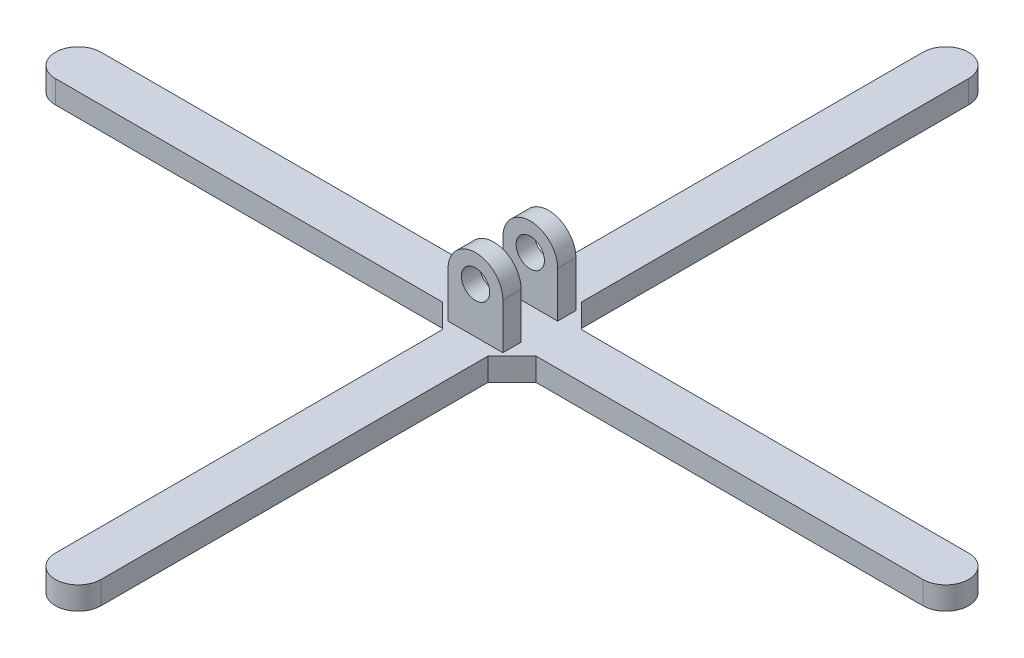
ISO-10303-21;
HEADER;
FILE_DESCRIPTION(('STEP AP214'),'2;1');
FILE_NAME('part.step','',(''),(''),'','','');
FILE_SCHEMA(('AUTOMOTIVE_DESIGN { 1 0 10303 214 1 1 1 1 }'));
ENDSEC;
DATA;
#1=APPLICATION_CONTEXT('core data for automotive mechanical design processes');
#2=APPLICATION_PROTOCOL_DEFINITION('international standard','automotive_design',2000,#1);
#3=PRODUCT_CONTEXT('',#1,'mechanical');
#4=PRODUCT('Part','Part','',(#3));
#5=PRODUCT_RELATED_PRODUCT_CATEGORY('part','',(#4));
#6=PRODUCT_DEFINITION_FORMATION('','',#4);
#7=PRODUCT_DEFINITION_CONTEXT('part definition',#1,'design');
#8=PRODUCT_DEFINITION('design','',#6,#7);
#9=PRODUCT_DEFINITION_SHAPE('','',#8);
#10=(LENGTH_UNIT() NAMED_UNIT(*) SI_UNIT(.MILLI.,.METRE.));
#11=(NAMED_UNIT(*) PLANE_ANGLE_UNIT() SI_UNIT($,.RADIAN.));
#12=(NAMED_UNIT(*) SI_UNIT($,.STERADIAN.) SOLID_ANGLE_UNIT());
#13=UNCERTAINTY_MEASURE_WITH_UNIT(LENGTH_MEASURE(1.E-05),#10,'distance_accuracy_value','');
#14=(GEOMETRIC_REPRESENTATION_CONTEXT(3) GLOBAL_UNCERTAINTY_ASSIGNED_CONTEXT((#13)) GLOBAL_UNIT_ASSIGNED_CONTEXT((#10,
#11,#12)) REPRESENTATION_CONTEXT('',''));
#15=CARTESIAN_POINT('',(0.,0.,0.));
#16=DIRECTION('',(0.,0.,1.));
#17=DIRECTION('',(1.,0.,0.));
#18=AXIS2_PLACEMENT_3D('',#15,#16,#17);
#19=CARTESIAN_POINT('',(2.17211307501375E-13,2.5,-47.5));
#20=DIRECTION('',(0.,1.,0.));
#21=DIRECTION('',(0.,0.,1.));
#22=AXIS2_PLACEMENT_3D('',#19,#20,#21);
#23=PLANE('',#22);
#24=DIRECTION('',(1.,0.,0.));
#25=VECTOR('',#24,1.);
#26=CARTESIAN_POINT('',(-3.,2.5,-4.));
#27=LINE('',#26,#25);
#28=CARTESIAN_POINT('',(-3.,2.5,-4.));
#29=VERTEX_POINT('',#28);
#30=CARTESIAN_POINT('',(3.,2.5,-4.));
#31=VERTEX_POINT('',#30);
#32=EDGE_CURVE('E222',#29,#31,#27,.T.);
#33=ORIENTED_EDGE('',*,*,#32,.T.);
#34=DIRECTION('',(0.,0.,1.));
#35=VECTOR('',#34,1.);
#36=CARTESIAN_POINT('',(3.,2.5,-4.));
#37=LINE('',#36,#35);
#38=CARTESIAN_POINT('',(3.,2.5,-2.));
#39=VERTEX_POINT('',#38);
#40=EDGE_CURVE('E252',#31,#39,#37,.T.);
#41=ORIENTED_EDGE('',*,*,#40,.T.);
#42=DIRECTION('',(1.,0.,0.));
#43=VECTOR('',#42,1.);
#44=CARTESIAN_POINT('',(-3.,2.5,-2.));
#45=LINE('',#44,#43);
#46=CARTESIAN_POINT('',(-3.,2.5,-2.));
#47=VERTEX_POINT('',#46);
#48=EDGE_CURVE('E225',#47,#39,#45,.T.);
#49=ORIENTED_EDGE('',*,*,#48,.F.);
#50=DIRECTION('',(0.,0.,1.));
#51=VECTOR('',#50,1.);
#52=CARTESIAN_POINT('',(-3.,2.5,-4.));
#53=LINE('',#52,#51);
#54=EDGE_CURVE('E237',#29,#47,#53,.T.);
#55=ORIENTED_EDGE('',*,*,#54,.F.);
#56=EDGE_LOOP('',(#33,#41,#49,#55));
#57=FACE_BOUND('',#56,.T.);
#58=CARTESIAN_POINT('',(2.17211307501375E-13,2.5,-47.5));
#59=DIRECTION('',(0.,1.,0.));
#60=DIRECTION('',(0.,0.,1.));
#61=AXIS2_PLACEMENT_3D('',#58,#59,#60);
#62=CIRCLE('',#61,2.49999999999999);
#63=CARTESIAN_POINT('',(2.49999999999999,2.5,-47.5));
#64=VERTEX_POINT('',#63);
#65=CARTESIAN_POINT('',(-2.49999999999999,2.5,-47.5));
#66=VERTEX_POINT('',#65);
#67=EDGE_CURVE('E306',#64,#66,#62,.T.);
#68=ORIENTED_EDGE('',*,*,#67,.T.);
#69=DIRECTION('',(0.,0.,1.));
#70=VECTOR('',#69,1.);
#71=CARTESIAN_POINT('',(-2.49999999999999,2.5,-47.5));
#72=LINE('',#71,#70);
#73=CARTESIAN_POINT('',(-2.49999999999998,2.5,-5.12626309606994));
#74=VERTEX_POINT('',#73);
#75=EDGE_CURVE('E310',#66,#74,#72,.T.);
#76=ORIENTED_EDGE('',*,*,#75,.T.);
#77=DIRECTION('',(-0.707106781186537,0.,0.707106781186558));
#78=VECTOR('',#77,1.);
#79=CARTESIAN_POINT('',(-5.12626309606985,2.5,-2.49999999999999));
#80=LINE('',#79,#78);
#81=CARTESIAN_POINT('',(-5.12626309606985,2.5,-2.49999999999999));
#82=VERTEX_POINT('',#81);
#83=EDGE_CURVE('E314',#74,#82,#80,.T.);
#84=ORIENTED_EDGE('',*,*,#83,.T.);
#85=DIRECTION('',(-1.,0.,0.));
#86=VECTOR('',#85,1.);
#87=CARTESIAN_POINT('',(-5.12626309606985,2.5,-2.49999999999999));
#88=LINE('',#87,#86);
#89=CARTESIAN_POINT('',(-47.5,2.5,-2.49999999999999));
#90=VERTEX_POINT('',#89);
#91=EDGE_CURVE('E317',#82,#90,#88,.T.);
#92=ORIENTED_EDGE('',*,*,#91,.T.);
#93=CARTESIAN_POINT('',(-47.5,2.5,0.));
#94=DIRECTION('',(0.,1.,0.));
#95=DIRECTION('',(0.,0.,1.));
#96=AXIS2_PLACEMENT_3D('',#93,#94,#95);
#97=CIRCLE('',#96,2.5);
#98=CARTESIAN_POINT('',(-47.5,2.5,2.50000000000001));
#99=VERTEX_POINT('',#98);
#100=EDGE_CURVE('E320',#90,#99,#97,.T.);
#101=ORIENTED_EDGE('',*,*,#100,.T.);
#102=DIRECTION('',(1.,0.,0.));
#103=VECTOR('',#102,1.);
#104=CARTESIAN_POINT('',(-5.12626309607015,2.5,2.50000000000001));
#105=LINE('',#104,#103);
#106=CARTESIAN_POINT('',(-5.12626309607015,2.5,2.50000000000001));
#107=VERTEX_POINT('',#106);
#108=EDGE_CURVE('E323',#99,#107,#105,.T.);
#109=ORIENTED_EDGE('',*,*,#108,.T.);
#110=DIRECTION('',(0.707106781186558,0.,0.707106781186537));
#111=VECTOR('',#110,1.);
#112=CARTESIAN_POINT('',(-2.49999999999998,2.5,5.1262630960701));
#113=LINE('',#112,#111);
#114=CARTESIAN_POINT('',(-2.49999999999998,2.5,5.1262630960701));
#115=VERTEX_POINT('',#114);
#116=EDGE_CURVE('E326',#107,#115,#113,.T.);
#117=ORIENTED_EDGE('',*,*,#116,.T.);
#118=DIRECTION('',(0.,0.,1.));
#119=VECTOR('',#118,1.);
#120=CARTESIAN_POINT('',(-2.49999999999998,2.5,5.1262630960701));
#121=LINE('',#120,#119);
#122=CARTESIAN_POINT('',(-2.49999999999997,2.5,47.5));
#123=VERTEX_POINT('',#122);
#124=EDGE_CURVE('E329',#115,#123,#121,.T.);
#125=ORIENTED_EDGE('',*,*,#124,.T.);
#126=CARTESIAN_POINT('',(0.,2.5,47.5));
#127=DIRECTION('',(0.,1.,0.));
#128=DIRECTION('',(0.,0.,1.));
#129=AXIS2_PLACEMENT_3D('',#126,#127,#128);
#130=CIRCLE('',#129,2.49999999999999);
#131=CARTESIAN_POINT('',(2.5,2.5,47.5));
#132=VERTEX_POINT('',#131);
#133=EDGE_CURVE('E332',#123,#132,#130,.T.);
#134=ORIENTED_EDGE('',*,*,#133,.T.);
#135=DIRECTION('',(0.,0.,-1.));
#136=VECTOR('',#135,1.);
#137=CARTESIAN_POINT('',(2.50000000000001,2.5,5.12626309607011));
#138=LINE('',#137,#136);
#139=CARTESIAN_POINT('',(2.50000000000001,2.5,5.12626309607011));
#140=VERTEX_POINT('',#139);
#141=EDGE_CURVE('E335',#132,#140,#138,.T.);
#142=ORIENTED_EDGE('',*,*,#141,.T.);
#143=DIRECTION('',(0.707106781186539,0.,-0.707106781186556));
#144=VECTOR('',#143,1.);
#145=CARTESIAN_POINT('',(5.12626309607005,2.5,2.50000000000001));
#146=LINE('',#145,#144);
#147=CARTESIAN_POINT('',(5.12626309607005,2.5,2.50000000000001));
#148=VERTEX_POINT('',#147);
#149=EDGE_CURVE('E338',#140,#148,#146,.T.);
#150=ORIENTED_EDGE('',*,*,#149,.T.);
#151=DIRECTION('',(1.,0.,0.));
#152=VECTOR('',#151,1.);
#153=CARTESIAN_POINT('',(47.5,2.5,2.5));
#154=LINE('',#153,#152);
#155=CARTESIAN_POINT('',(47.5,2.5,2.50000000000003));
#156=VERTEX_POINT('',#155);
#157=EDGE_CURVE('E341',#148,#156,#154,.T.);
#158=ORIENTED_EDGE('',*,*,#157,.T.);
#159=CARTESIAN_POINT('',(47.5,2.5,0.));
#160=DIRECTION('',(0.,1.,0.));
#161=DIRECTION('',(0.,0.,1.));
#162=AXIS2_PLACEMENT_3D('',#159,#160,#161);
#163=CIRCLE('',#162,2.5);
#164=CARTESIAN_POINT('',(47.5,2.5,-2.5));
#165=VERTEX_POINT('',#164);
#166=EDGE_CURVE('E344',#156,#165,#163,.T.);
#167=ORIENTED_EDGE('',*,*,#166,.T.);
#168=DIRECTION('',(-1.,0.,0.));
#169=VECTOR('',#168,1.);
#170=CARTESIAN_POINT('',(47.5,2.5,-2.5));
#171=LINE('',#170,#169);
#172=CARTESIAN_POINT('',(5.12626309607004,2.5,-2.49999999999999));
#173=VERTEX_POINT('',#172);
#174=EDGE_CURVE('E347',#165,#173,#171,.T.);
#175=ORIENTED_EDGE('',*,*,#174,.T.);
#176=DIRECTION('',(-0.707106781186558,0.,-0.707106781186537));
#177=VECTOR('',#176,1.);
#178=CARTESIAN_POINT('',(2.50000000000002,2.5,-5.12626309606994));
#179=LINE('',#178,#177);
#180=CARTESIAN_POINT('',(2.50000000000002,2.5,-5.12626309606994));
#181=VERTEX_POINT('',#180);
#182=EDGE_CURVE('E350',#173,#181,#179,.T.);
#183=ORIENTED_EDGE('',*,*,#182,.T.);
#184=DIRECTION('',(0.,0.,-1.));
#185=VECTOR('',#184,1.);
#186=CARTESIAN_POINT('',(2.49999999999999,2.5,-47.5));
#187=LINE('',#186,#185);
#188=EDGE_CURVE('E353',#181,#64,#187,.T.);
#189=ORIENTED_EDGE('',*,*,#188,.T.);
#190=EDGE_LOOP('',(#68,#76,#84,#92,#101,#109,#117,#125,#134,#142,#150,#158,#167,#175,#183,#189));
#191=FACE_BOUND('',#190,.T.);
#192=DIRECTION('',(1.,0.,0.));
#193=VECTOR('',#192,1.);
#194=CARTESIAN_POINT('',(-3.,2.5,4.));
#195=LINE('',#194,#193);
#196=CARTESIAN_POINT('',(-3.,2.5,4.));
#197=VERTEX_POINT('',#196);
#198=CARTESIAN_POINT('',(3.,2.5,4.));
#199=VERTEX_POINT('',#198);
#200=EDGE_CURVE('E269',#197,#199,#195,.T.);
#201=ORIENTED_EDGE('',*,*,#200,.F.);
#202=DIRECTION('',(0.,0.,-1.));
#203=VECTOR('',#202,1.);
#204=CARTESIAN_POINT('',(-3.,2.5,4.));
#205=LINE('',#204,#203);
#206=CARTESIAN_POINT('',(-3.,2.5,2.));
#207=VERTEX_POINT('',#206);
#208=EDGE_CURVE('E301',#197,#207,#205,.T.);
#209=ORIENTED_EDGE('',*,*,#208,.T.);
#210=DIRECTION('',(1.,0.,0.));
#211=VECTOR('',#210,1.);
#212=CARTESIAN_POINT('',(-3.,2.5,2.));
#213=LINE('',#212,#211);
#214=CARTESIAN_POINT('',(3.,2.5,2.));
#215=VERTEX_POINT('',#214);
#216=EDGE_CURVE('E282',#207,#215,#213,.T.);
#217=ORIENTED_EDGE('',*,*,#216,.T.);
#218=DIRECTION('',(0.,0.,-1.));
#219=VECTOR('',#218,1.);
#220=CARTESIAN_POINT('',(3.,2.5,4.));
#221=LINE('',#220,#219);
#222=EDGE_CURVE('E298',#199,#215,#221,.T.);
#223=ORIENTED_EDGE('',*,*,#222,.F.);
#224=EDGE_LOOP('',(#201,#209,#217,#223));
#225=FACE_BOUND('',#224,.T.);
#226=ADVANCED_FACE('F41',(#57,#191,#225),#23,.T.);
#227=CARTESIAN_POINT('',(2.17211307501375E-13,2.5,-47.5));
#228=DIRECTION('',(0.,-1.,0.));
#229=DIRECTION('',(0.,0.,-1.));
#230=AXIS2_PLACEMENT_3D('',#227,#228,#229);
#231=CYLINDRICAL_SURFACE('',#230,2.49999999999999);
#232=CARTESIAN_POINT('',(2.17211307501375E-13,0.,-47.5));
#233=DIRECTION('',(0.,1.,0.));
#234=DIRECTION('',(0.,0.,1.));
#235=AXIS2_PLACEMENT_3D('',#232,#233,#234);
#236=CIRCLE('',#235,2.49999999999999);
#237=CARTESIAN_POINT('',(2.49999999999999,0.,-47.5));
#238=VERTEX_POINT('',#237);
#239=CARTESIAN_POINT('',(-2.49999999999999,0.,-47.5));
#240=VERTEX_POINT('',#239);
#241=EDGE_CURVE('E305',#238,#240,#236,.T.);
#242=ORIENTED_EDGE('',*,*,#241,.T.);
#243=DIRECTION('',(0.,-1.,0.));
#244=VECTOR('',#243,1.);
#245=CARTESIAN_POINT('',(-2.49999999999999,2.5,-47.5));
#246=LINE('',#245,#244);
#247=EDGE_CURVE('E11',#66,#240,#246,.T.);
#248=ORIENTED_EDGE('',*,*,#247,.F.);
#249=ORIENTED_EDGE('',*,*,#67,.F.);
#250=DIRECTION('',(0.,-1.,0.));
#251=VECTOR('',#250,1.);
#252=CARTESIAN_POINT('',(2.49999999999999,2.5,-47.5));
#253=LINE('',#252,#251);
#254=EDGE_CURVE('E356',#64,#238,#253,.T.);
#255=ORIENTED_EDGE('',*,*,#254,.T.);
#256=EDGE_LOOP('',(#242,#248,#249,#255));
#257=FACE_BOUND('',#256,.T.);
#258=ADVANCED_FACE('F43',(#257),#231,.T.);
#259=CARTESIAN_POINT('',(-2.49999999999999,2.5,-47.5));
#260=DIRECTION('',(1.,0.,0.));
#261=DIRECTION('',(0.,0.,-1.));
#262=AXIS2_PLACEMENT_3D('',#259,#260,#261);
#263=PLANE('',#262);
#264=DIRECTION('',(0.,0.,1.));
#265=VECTOR('',#264,1.);
#266=CARTESIAN_POINT('',(-2.49999999999999,0.,-47.5));
#267=LINE('',#266,#265);
#268=CARTESIAN_POINT('',(-2.49999999999998,0.,-5.12626309606994));
#269=VERTEX_POINT('',#268);
#270=EDGE_CURVE('E360',#240,#269,#267,.T.);
#271=ORIENTED_EDGE('',*,*,#270,.T.);
#272=DIRECTION('',(0.,-1.,0.));
#273=VECTOR('',#272,1.);
#274=CARTESIAN_POINT('',(-2.49999999999998,2.5,-5.12626309606994));
#275=LINE('',#274,#273);
#276=EDGE_CURVE('E50',#74,#269,#275,.T.);
#277=ORIENTED_EDGE('',*,*,#276,.F.);
#278=ORIENTED_EDGE('',*,*,#75,.F.);
#279=ORIENTED_EDGE('',*,*,#247,.T.);
#280=EDGE_LOOP('',(#271,#277,#278,#279));
#281=FACE_BOUND('',#280,.T.);
#282=ADVANCED_FACE('F487',(#281),#263,.F.);
#283=CARTESIAN_POINT('',(-5.12626309606985,2.5,-2.49999999999999));
#284=DIRECTION('',(0.707106781186558,0.,0.707106781186537));
#285=DIRECTION('',(0.707106781186537,0.,-0.707106781186558));
#286=AXIS2_PLACEMENT_3D('',#283,#284,#285);
#287=PLANE('',#286);
#288=DIRECTION('',(-0.707106781186537,0.,0.707106781186558));
#289=VECTOR('',#288,1.);
#290=CARTESIAN_POINT('',(-5.12626309606985,0.,-2.49999999999999));
#291=LINE('',#290,#289);
#292=CARTESIAN_POINT('',(-5.12626309606985,0.,-2.49999999999999));
#293=VERTEX_POINT('',#292);
#294=EDGE_CURVE('E363',#269,#293,#291,.T.);
#295=ORIENTED_EDGE('',*,*,#294,.T.);
#296=DIRECTION('',(0.,-1.,0.));
#297=VECTOR('',#296,1.);
#298=CARTESIAN_POINT('',(-5.12626309606985,2.5,-2.49999999999999));
#299=LINE('',#298,#297);
#300=EDGE_CURVE('E455',#82,#293,#299,.T.);
#301=ORIENTED_EDGE('',*,*,#300,.F.);
#302=ORIENTED_EDGE('',*,*,#83,.F.);
#303=ORIENTED_EDGE('',*,*,#276,.T.);
#304=EDGE_LOOP('',(#295,#301,#302,#303));
#305=FACE_BOUND('',#304,.T.);
#306=ADVANCED_FACE('F464',(#305),#287,.F.);
#307=CARTESIAN_POINT('',(-5.12626309606985,2.5,-2.49999999999999));
#308=DIRECTION('',(0.,0.,1.));
#309=DIRECTION('',(1.,0.,0.));
#310=AXIS2_PLACEMENT_3D('',#307,#308,#309);
#311=PLANE('',#310);
#312=DIRECTION('',(-1.,0.,0.));
#313=VECTOR('',#312,1.);
#314=CARTESIAN_POINT('',(-5.12626309606985,0.,-2.49999999999999));
#315=LINE('',#314,#313);
#316=CARTESIAN_POINT('',(-47.5,0.,-2.49999999999999));
#317=VERTEX_POINT('',#316);
#318=EDGE_CURVE('E366',#293,#317,#315,.T.);
#319=ORIENTED_EDGE('',*,*,#318,.T.);
#320=DIRECTION('',(0.,-1.,0.));
#321=VECTOR('',#320,1.);
#322=CARTESIAN_POINT('',(-47.5,2.5,-2.49999999999999));
#323=LINE('',#322,#321);
#324=EDGE_CURVE('E451',#90,#317,#323,.T.);
#325=ORIENTED_EDGE('',*,*,#324,.F.);
#326=ORIENTED_EDGE('',*,*,#91,.F.);
#327=ORIENTED_EDGE('',*,*,#300,.T.);
#328=EDGE_LOOP('',(#319,#325,#326,#327));
#329=FACE_BOUND('',#328,.T.);
#330=ADVANCED_FACE('F475',(#329),#311,.F.);
#331=CARTESIAN_POINT('',(-47.5,2.5,0.));
#332=DIRECTION('',(0.,-1.,0.));
#333=DIRECTION('',(0.,0.,-1.));
#334=AXIS2_PLACEMENT_3D('',#331,#332,#333);
#335=CYLINDRICAL_SURFACE('',#334,2.5);
#336=CARTESIAN_POINT('',(-47.5,0.,0.));
#337=DIRECTION('',(0.,1.,0.));
#338=DIRECTION('',(0.,0.,1.));
#339=AXIS2_PLACEMENT_3D('',#336,#337,#338);
#340=CIRCLE('',#339,2.5);
#341=CARTESIAN_POINT('',(-47.5,0.,2.50000000000001));
#342=VERTEX_POINT('',#341);
#343=EDGE_CURVE('E369',#317,#342,#340,.T.);
#344=ORIENTED_EDGE('',*,*,#343,.T.);
#345=DIRECTION('',(0.,-1.,0.));
#346=VECTOR('',#345,1.);
#347=CARTESIAN_POINT('',(-47.5,2.5,2.50000000000001));
#348=LINE('',#347,#346);
#349=EDGE_CURVE('E447',#99,#342,#348,.T.);
#350=ORIENTED_EDGE('',*,*,#349,.F.);
#351=ORIENTED_EDGE('',*,*,#100,.F.);
#352=ORIENTED_EDGE('',*,*,#324,.T.);
#353=EDGE_LOOP('',(#344,#350,#351,#352));
#354=FACE_BOUND('',#353,.T.);
#355=ADVANCED_FACE('F479',(#354),#335,.T.);
#356=CARTESIAN_POINT('',(-5.12626309607015,2.5,2.50000000000001));
#357=DIRECTION('',(0.,0.,-1.));
#358=DIRECTION('',(-1.,0.,0.));
#359=AXIS2_PLACEMENT_3D('',#356,#357,#358);
#360=PLANE('',#359);
#361=DIRECTION('',(1.,0.,0.));
#362=VECTOR('',#361,1.);
#363=CARTESIAN_POINT('',(-5.12626309607015,0.,2.50000000000001));
#364=LINE('',#363,#362);
#365=CARTESIAN_POINT('',(-5.12626309607015,0.,2.50000000000001));
#366=VERTEX_POINT('',#365);
#367=EDGE_CURVE('E372',#342,#366,#364,.T.);
#368=ORIENTED_EDGE('',*,*,#367,.T.);
#369=DIRECTION('',(0.,-1.,0.));
#370=VECTOR('',#369,1.);
#371=CARTESIAN_POINT('',(-5.12626309607015,2.5,2.50000000000001));
#372=LINE('',#371,#370);
#373=EDGE_CURVE('E443',#107,#366,#372,.T.);
#374=ORIENTED_EDGE('',*,*,#373,.F.);
#375=ORIENTED_EDGE('',*,*,#108,.F.);
#376=ORIENTED_EDGE('',*,*,#349,.T.);
#377=EDGE_LOOP('',(#368,#374,#375,#376));
#378=FACE_BOUND('',#377,.T.);
#379=ADVANCED_FACE('F540',(#378),#360,.F.);
#380=CARTESIAN_POINT('',(-2.49999999999998,2.5,5.1262630960701));
#381=DIRECTION('',(0.707106781186537,0.,-0.707106781186558));
#382=DIRECTION('',(-0.707106781186558,0.,-0.707106781186537));
#383=AXIS2_PLACEMENT_3D('',#380,#381,#382);
#384=PLANE('',#383);
#385=DIRECTION('',(0.707106781186558,0.,0.707106781186537));
#386=VECTOR('',#385,1.);
#387=CARTESIAN_POINT('',(-2.49999999999998,0.,5.1262630960701));
#388=LINE('',#387,#386);
#389=CARTESIAN_POINT('',(-2.49999999999998,0.,5.1262630960701));
#390=VERTEX_POINT('',#389);
#391=EDGE_CURVE('E375',#366,#390,#388,.T.);
#392=ORIENTED_EDGE('',*,*,#391,.T.);
#393=DIRECTION('',(0.,-1.,0.));
#394=VECTOR('',#393,1.);
#395=CARTESIAN_POINT('',(-2.49999999999998,2.5,5.1262630960701));
#396=LINE('',#395,#394);
#397=EDGE_CURVE('E439',#115,#390,#396,.T.);
#398=ORIENTED_EDGE('',*,*,#397,.F.);
#399=ORIENTED_EDGE('',*,*,#116,.F.);
#400=ORIENTED_EDGE('',*,*,#373,.T.);
#401=EDGE_LOOP('',(#392,#398,#399,#400));
#402=FACE_BOUND('',#401,.T.);
#403=ADVANCED_FACE('F537',(#402),#384,.F.);
#404=CARTESIAN_POINT('',(-2.49999999999998,2.5,5.1262630960701));
#405=DIRECTION('',(1.,0.,0.));
#406=DIRECTION('',(0.,0.,-1.));
#407=AXIS2_PLACEMENT_3D('',#404,#405,#406);
#408=PLANE('',#407);
#409=DIRECTION('',(0.,0.,1.));
#410=VECTOR('',#409,1.);
#411=CARTESIAN_POINT('',(-2.49999999999998,0.,5.1262630960701));
#412=LINE('',#411,#410);
#413=CARTESIAN_POINT('',(-2.49999999999997,0.,47.5));
#414=VERTEX_POINT('',#413);
#415=EDGE_CURVE('E378',#390,#414,#412,.T.);
#416=ORIENTED_EDGE('',*,*,#415,.T.);
#417=DIRECTION('',(0.,-1.,0.));
#418=VECTOR('',#417,1.);
#419=CARTESIAN_POINT('',(-2.49999999999997,2.5,47.5));
#420=LINE('',#419,#418);
#421=EDGE_CURVE('E435',#123,#414,#420,.T.);
#422=ORIENTED_EDGE('',*,*,#421,.F.);
#423=ORIENTED_EDGE('',*,*,#124,.F.);
#424=ORIENTED_EDGE('',*,*,#397,.T.);
#425=EDGE_LOOP('',(#416,#422,#423,#424));
#426=FACE_BOUND('',#425,.T.);
#427=ADVANCED_FACE('F533',(#426),#408,.F.);
#428=CARTESIAN_POINT('',(0.,2.5,47.5));
#429=DIRECTION('',(0.,-1.,0.));
#430=DIRECTION('',(0.,0.,-1.));
#431=AXIS2_PLACEMENT_3D('',#428,#429,#430);
#432=CYLINDRICAL_SURFACE('',#431,2.49999999999999);
#433=CARTESIAN_POINT('',(0.,0.,47.5));
#434=DIRECTION('',(0.,1.,0.));
#435=DIRECTION('',(0.,0.,1.));
#436=AXIS2_PLACEMENT_3D('',#433,#434,#435);
#437=CIRCLE('',#436,2.49999999999999);
#438=CARTESIAN_POINT('',(2.5,0.,47.5));
#439=VERTEX_POINT('',#438);
#440=EDGE_CURVE('E381',#414,#439,#437,.T.);
#441=ORIENTED_EDGE('',*,*,#440,.T.);
#442=DIRECTION('',(0.,-1.,0.));
#443=VECTOR('',#442,1.);
#444=CARTESIAN_POINT('',(2.5,2.5,47.5));
#445=LINE('',#444,#443);
#446=EDGE_CURVE('E431',#132,#439,#445,.T.);
#447=ORIENTED_EDGE('',*,*,#446,.F.);
#448=ORIENTED_EDGE('',*,*,#133,.F.);
#449=ORIENTED_EDGE('',*,*,#421,.T.);
#450=EDGE_LOOP('',(#441,#447,#448,#449));
#451=FACE_BOUND('',#450,.T.);
#452=ADVANCED_FACE('F529',(#451),#432,.T.);
#453=CARTESIAN_POINT('',(2.50000000000001,2.5,5.12626309607011));
#454=DIRECTION('',(-1.,0.,0.));
#455=DIRECTION('',(0.,0.,1.));
#456=AXIS2_PLACEMENT_3D('',#453,#454,#455);
#457=PLANE('',#456);
#458=DIRECTION('',(0.,0.,-1.));
#459=VECTOR('',#458,1.);
#460=CARTESIAN_POINT('',(2.50000000000001,0.,5.12626309607011));
#461=LINE('',#460,#459);
#462=CARTESIAN_POINT('',(2.50000000000001,0.,5.12626309607011));
#463=VERTEX_POINT('',#462);
#464=EDGE_CURVE('E384',#439,#463,#461,.T.);
#465=ORIENTED_EDGE('',*,*,#464,.T.);
#466=DIRECTION('',(0.,-1.,0.));
#467=VECTOR('',#466,1.);
#468=CARTESIAN_POINT('',(2.50000000000001,2.5,5.12626309607011));
#469=LINE('',#468,#467);
#470=EDGE_CURVE('E427',#140,#463,#469,.T.);
#471=ORIENTED_EDGE('',*,*,#470,.F.);
#472=ORIENTED_EDGE('',*,*,#141,.F.);
#473=ORIENTED_EDGE('',*,*,#446,.T.);
#474=EDGE_LOOP('',(#465,#471,#472,#473));
#475=FACE_BOUND('',#474,.T.);
#476=ADVANCED_FACE('F524',(#475),#457,.F.);
#477=CARTESIAN_POINT('',(5.12626309607005,2.5,2.50000000000001));
#478=DIRECTION('',(-0.707106781186556,0.,-0.707106781186539));
#479=DIRECTION('',(-0.707106781186539,0.,0.707106781186556));
#480=AXIS2_PLACEMENT_3D('',#477,#478,#479);
#481=PLANE('',#480);
#482=DIRECTION('',(0.707106781186539,0.,-0.707106781186556));
#483=VECTOR('',#482,1.);
#484=CARTESIAN_POINT('',(5.12626309607005,0.,2.50000000000001));
#485=LINE('',#484,#483);
#486=CARTESIAN_POINT('',(5.12626309607005,0.,2.50000000000001));
#487=VERTEX_POINT('',#486);
#488=EDGE_CURVE('E387',#463,#487,#485,.T.);
#489=ORIENTED_EDGE('',*,*,#488,.T.);
#490=DIRECTION('',(0.,-1.,0.));
#491=VECTOR('',#490,1.);
#492=CARTESIAN_POINT('',(5.12626309607005,2.5,2.50000000000001));
#493=LINE('',#492,#491);
#494=EDGE_CURVE('E423',#148,#487,#493,.T.);
#495=ORIENTED_EDGE('',*,*,#494,.F.);
#496=ORIENTED_EDGE('',*,*,#149,.F.);
#497=ORIENTED_EDGE('',*,*,#470,.T.);
#498=EDGE_LOOP('',(#489,#495,#496,#497));
#499=FACE_BOUND('',#498,.T.);
#500=ADVANCED_FACE('F518',(#499),#481,.F.);
#501=CARTESIAN_POINT('',(47.5,2.5,2.5));
#502=DIRECTION('',(0.,0.,-1.));
#503=DIRECTION('',(-1.,0.,0.));
#504=AXIS2_PLACEMENT_3D('',#501,#502,#503);
#505=PLANE('',#504);
#506=DIRECTION('',(1.,0.,0.));
#507=VECTOR('',#506,1.);
#508=CARTESIAN_POINT('',(47.5,0.,2.5));
#509=LINE('',#508,#507);
#510=CARTESIAN_POINT('',(47.5,0.,2.50000000000003));
#511=VERTEX_POINT('',#510);
#512=EDGE_CURVE('E390',#487,#511,#509,.T.);
#513=ORIENTED_EDGE('',*,*,#512,.T.);
#514=DIRECTION('',(0.,-1.,0.));
#515=VECTOR('',#514,1.);
#516=CARTESIAN_POINT('',(47.5,2.5,2.50000000000003));
#517=LINE('',#516,#515);
#518=EDGE_CURVE('E419',#156,#511,#517,.T.);
#519=ORIENTED_EDGE('',*,*,#518,.F.);
#520=ORIENTED_EDGE('',*,*,#157,.F.);
#521=ORIENTED_EDGE('',*,*,#494,.T.);
#522=EDGE_LOOP('',(#513,#519,#520,#521));
#523=FACE_BOUND('',#522,.T.);
#524=ADVANCED_FACE('F514',(#523),#505,.F.);
#525=CARTESIAN_POINT('',(47.5,2.5,0.));
#526=DIRECTION('',(0.,-1.,0.));
#527=DIRECTION('',(0.,0.,-1.));
#528=AXIS2_PLACEMENT_3D('',#525,#526,#527);
#529=CYLINDRICAL_SURFACE('',#528,2.5);
#530=CARTESIAN_POINT('',(47.5,0.,0.));
#531=DIRECTION('',(0.,1.,0.));
#532=DIRECTION('',(0.,0.,1.));
#533=AXIS2_PLACEMENT_3D('',#530,#531,#532);
#534=CIRCLE('',#533,2.5);
#535=CARTESIAN_POINT('',(47.5,0.,-2.5));
#536=VERTEX_POINT('',#535);
#537=EDGE_CURVE('E393',#511,#536,#534,.T.);
#538=ORIENTED_EDGE('',*,*,#537,.T.);
#539=DIRECTION('',(0.,-1.,0.));
#540=VECTOR('',#539,1.);
#541=CARTESIAN_POINT('',(47.5,2.5,-2.5));
#542=LINE('',#541,#540);
#543=EDGE_CURVE('E415',#165,#536,#542,.T.);
#544=ORIENTED_EDGE('',*,*,#543,.F.);
#545=ORIENTED_EDGE('',*,*,#166,.F.);
#546=ORIENTED_EDGE('',*,*,#518,.T.);
#547=EDGE_LOOP('',(#538,#544,#545,#546));
#548=FACE_BOUND('',#547,.T.);
#549=ADVANCED_FACE('F509',(#548),#529,.T.);
#550=CARTESIAN_POINT('',(47.5,2.5,-2.5));
#551=DIRECTION('',(0.,0.,1.));
#552=DIRECTION('',(1.,0.,0.));
#553=AXIS2_PLACEMENT_3D('',#550,#551,#552);
#554=PLANE('',#553);
#555=DIRECTION('',(-1.,0.,0.));
#556=VECTOR('',#555,1.);
#557=CARTESIAN_POINT('',(47.5,0.,-2.5));
#558=LINE('',#557,#556);
#559=CARTESIAN_POINT('',(5.12626309607004,0.,-2.49999999999999));
#560=VERTEX_POINT('',#559);
#561=EDGE_CURVE('E396',#536,#560,#558,.T.);
#562=ORIENTED_EDGE('',*,*,#561,.T.);
#563=DIRECTION('',(0.,-1.,0.));
#564=VECTOR('',#563,1.);
#565=CARTESIAN_POINT('',(5.12626309607004,2.5,-2.49999999999999));
#566=LINE('',#565,#564);
#567=EDGE_CURVE('E411',#173,#560,#566,.T.);
#568=ORIENTED_EDGE('',*,*,#567,.F.);
#569=ORIENTED_EDGE('',*,*,#174,.F.);
#570=ORIENTED_EDGE('',*,*,#543,.T.);
#571=EDGE_LOOP('',(#562,#568,#569,#570));
#572=FACE_BOUND('',#571,.T.);
#573=ADVANCED_FACE('F503',(#572),#554,.F.);
#574=CARTESIAN_POINT('',(2.50000000000002,2.5,-5.12626309606994));
#575=DIRECTION('',(-0.707106781186537,0.,0.707106781186558));
#576=DIRECTION('',(0.707106781186558,0.,0.707106781186537));
#577=AXIS2_PLACEMENT_3D('',#574,#575,#576);
#578=PLANE('',#577);
#579=DIRECTION('',(-0.707106781186558,0.,-0.707106781186537));
#580=VECTOR('',#579,1.);
#581=CARTESIAN_POINT('',(2.50000000000002,0.,-5.12626309606994));
#582=LINE('',#581,#580);
#583=CARTESIAN_POINT('',(2.50000000000002,0.,-5.12626309606994));
#584=VERTEX_POINT('',#583);
#585=EDGE_CURVE('E399',#560,#584,#582,.T.);
#586=ORIENTED_EDGE('',*,*,#585,.T.);
#587=DIRECTION('',(0.,-1.,0.));
#588=VECTOR('',#587,1.);
#589=CARTESIAN_POINT('',(2.50000000000002,2.5,-5.12626309606994));
#590=LINE('',#589,#588);
#591=EDGE_CURVE('E407',#181,#584,#590,.T.);
#592=ORIENTED_EDGE('',*,*,#591,.F.);
#593=ORIENTED_EDGE('',*,*,#182,.F.);
#594=ORIENTED_EDGE('',*,*,#567,.T.);
#595=EDGE_LOOP('',(#586,#592,#593,#594));
#596=FACE_BOUND('',#595,.T.);
#597=ADVANCED_FACE('F499',(#596),#578,.F.);
#598=CARTESIAN_POINT('',(2.49999999999999,2.5,-47.5));
#599=DIRECTION('',(-1.,0.,0.));
#600=DIRECTION('',(0.,0.,1.));
#601=AXIS2_PLACEMENT_3D('',#598,#599,#600);
#602=PLANE('',#601);
#603=DIRECTION('',(0.,0.,-1.));
#604=VECTOR('',#603,1.);
#605=CARTESIAN_POINT('',(2.49999999999999,0.,-47.5));
#606=LINE('',#605,#604);
#607=EDGE_CURVE('E311',#584,#238,#606,.T.);
#608=ORIENTED_EDGE('',*,*,#607,.T.);
#609=ORIENTED_EDGE('',*,*,#254,.F.);
#610=ORIENTED_EDGE('',*,*,#188,.F.);
#611=ORIENTED_EDGE('',*,*,#591,.T.);
#612=EDGE_LOOP('',(#608,#609,#610,#611));
#613=FACE_BOUND('',#612,.T.);
#614=ADVANCED_FACE('F494',(#613),#602,.F.);
#615=CARTESIAN_POINT('',(2.17211307501375E-13,0.,-47.5));
#616=DIRECTION('',(0.,1.,0.));
#617=DIRECTION('',(0.,0.,1.));
#618=AXIS2_PLACEMENT_3D('',#615,#616,#617);
#619=PLANE('',#618);
#620=ORIENTED_EDGE('',*,*,#241,.F.);
#621=ORIENTED_EDGE('',*,*,#607,.F.);
#622=ORIENTED_EDGE('',*,*,#585,.F.);
#623=ORIENTED_EDGE('',*,*,#561,.F.);
#624=ORIENTED_EDGE('',*,*,#537,.F.);
#625=ORIENTED_EDGE('',*,*,#512,.F.);
#626=ORIENTED_EDGE('',*,*,#488,.F.);
#627=ORIENTED_EDGE('',*,*,#464,.F.);
#628=ORIENTED_EDGE('',*,*,#440,.F.);
#629=ORIENTED_EDGE('',*,*,#415,.F.);
#630=ORIENTED_EDGE('',*,*,#391,.F.);
#631=ORIENTED_EDGE('',*,*,#367,.F.);
#632=ORIENTED_EDGE('',*,*,#343,.F.);
#633=ORIENTED_EDGE('',*,*,#318,.F.);
#634=ORIENTED_EDGE('',*,*,#294,.F.);
#635=ORIENTED_EDGE('',*,*,#270,.F.);
#636=EDGE_LOOP('',(#620,#621,#622,#623,#624,#625,#626,#627,#628,#629,#630,#631,#632,#633,#634,#635));
#637=FACE_BOUND('',#636,.T.);
#638=ADVANCED_FACE('F470',(#637),#619,.F.);
#639=CARTESIAN_POINT('',(0.,7.5,4.));
#640=DIRECTION('',(0.,0.,1.));
#641=DIRECTION('',(1.,0.,0.));
#642=AXIS2_PLACEMENT_3D('',#639,#640,#641);
#643=PLANE('',#642);
#644=DIRECTION('',(0.,-1.,0.));
#645=VECTOR('',#644,1.);
#646=CARTESIAN_POINT('',(-3.,2.5,4.));
#647=LINE('',#646,#645);
#648=CARTESIAN_POINT('',(-3.,7.5,4.));
#649=VERTEX_POINT('',#648);
#650=EDGE_CURVE('E266',#649,#197,#647,.T.);
#651=ORIENTED_EDGE('',*,*,#650,.T.);
#652=ORIENTED_EDGE('',*,*,#200,.T.);
#653=DIRECTION('',(0.,1.,0.));
#654=VECTOR('',#653,1.);
#655=CARTESIAN_POINT('',(3.,2.5,4.));
#656=LINE('',#655,#654);
#657=CARTESIAN_POINT('',(3.,7.5,4.));
#658=VERTEX_POINT('',#657);
#659=EDGE_CURVE('E65',#199,#658,#656,.T.);
#660=ORIENTED_EDGE('',*,*,#659,.T.);
#661=CARTESIAN_POINT('',(0.,7.5,4.));
#662=DIRECTION('',(0.,0.,1.));
#663=DIRECTION('',(1.,0.,0.));
#664=AXIS2_PLACEMENT_3D('',#661,#662,#663);
#665=CIRCLE('',#664,3.);
#666=EDGE_CURVE('E275',#658,#649,#665,.T.);
#667=ORIENTED_EDGE('',*,*,#666,.T.);
#668=EDGE_LOOP('',(#651,#652,#660,#667));
#669=FACE_BOUND('',#668,.T.);
#670=CARTESIAN_POINT('',(0.,7.5,4.));
#671=DIRECTION('',(0.,0.,1.));
#672=DIRECTION('',(1.,0.,0.));
#673=AXIS2_PLACEMENT_3D('',#670,#671,#672);
#674=CIRCLE('',#673,1.55);
#675=CARTESIAN_POINT('',(1.55,7.5,4.));
#676=VERTEX_POINT('',#675);
#677=EDGE_CURVE('E258',#676,#676,#674,.T.);
#678=ORIENTED_EDGE('',*,*,#677,.F.);
#679=EDGE_LOOP('',(#678));
#680=FACE_BOUND('',#679,.T.);
#681=ADVANCED_FACE('F561',(#669,#680),#643,.T.);
#682=CARTESIAN_POINT('',(0.,7.5,2.));
#683=DIRECTION('',(0.,0.,1.));
#684=DIRECTION('',(1.,0.,0.));
#685=AXIS2_PLACEMENT_3D('',#682,#683,#684);
#686=PLANE('',#685);
#687=DIRECTION('',(0.,-1.,0.));
#688=VECTOR('',#687,1.);
#689=CARTESIAN_POINT('',(-3.,2.5,2.));
#690=LINE('',#689,#688);
#691=CARTESIAN_POINT('',(-3.,7.5,2.));
#692=VERTEX_POINT('',#691);
#693=EDGE_CURVE('E262',#692,#207,#690,.T.);
#694=ORIENTED_EDGE('',*,*,#693,.F.);
#695=CARTESIAN_POINT('',(0.,7.5,2.));
#696=DIRECTION('',(0.,0.,1.));
#697=DIRECTION('',(1.,0.,0.));
#698=AXIS2_PLACEMENT_3D('',#695,#696,#697);
#699=CIRCLE('',#698,3.);
#700=CARTESIAN_POINT('',(3.,7.5,2.));
#701=VERTEX_POINT('',#700);
#702=EDGE_CURVE('E270',#701,#692,#699,.T.);
#703=ORIENTED_EDGE('',*,*,#702,.F.);
#704=DIRECTION('',(0.,1.,0.));
#705=VECTOR('',#704,1.);
#706=CARTESIAN_POINT('',(3.,2.5,2.));
#707=LINE('',#706,#705);
#708=EDGE_CURVE('E286',#215,#701,#707,.T.);
#709=ORIENTED_EDGE('',*,*,#708,.F.);
#710=ORIENTED_EDGE('',*,*,#216,.F.);
#711=EDGE_LOOP('',(#694,#703,#709,#710));
#712=FACE_BOUND('',#711,.T.);
#713=CARTESIAN_POINT('',(0.,7.5,2.));
#714=DIRECTION('',(0.,0.,1.));
#715=DIRECTION('',(1.,0.,0.));
#716=AXIS2_PLACEMENT_3D('',#713,#714,#715);
#717=CIRCLE('',#716,1.55);
#718=CARTESIAN_POINT('',(1.55,7.5,2.));
#719=VERTEX_POINT('',#718);
#720=EDGE_CURVE('E212',#719,#719,#717,.T.);
#721=ORIENTED_EDGE('',*,*,#720,.T.);
#722=EDGE_LOOP('',(#721));
#723=FACE_BOUND('',#722,.T.);
#724=ADVANCED_FACE('F625',(#712,#723),#686,.F.);
#725=CARTESIAN_POINT('',(-3.,2.5,4.));
#726=DIRECTION('',(1.,0.,0.));
#727=DIRECTION('',(0.,1.,0.));
#728=AXIS2_PLACEMENT_3D('',#725,#726,#727);
#729=PLANE('',#728);
#730=ORIENTED_EDGE('',*,*,#693,.T.);
#731=ORIENTED_EDGE('',*,*,#208,.F.);
#732=ORIENTED_EDGE('',*,*,#650,.F.);
#733=DIRECTION('',(0.,0.,-1.));
#734=VECTOR('',#733,1.);
#735=CARTESIAN_POINT('',(-3.,7.5,4.));
#736=LINE('',#735,#734);
#737=EDGE_CURVE('E278',#649,#692,#736,.T.);
#738=ORIENTED_EDGE('',*,*,#737,.T.);
#739=EDGE_LOOP('',(#730,#731,#732,#738));
#740=FACE_BOUND('',#739,.T.);
#741=ADVANCED_FACE('F557',(#740),#729,.F.);
#742=CARTESIAN_POINT('',(3.,2.5,4.));
#743=DIRECTION('',(-1.,0.,0.));
#744=DIRECTION('',(0.,-1.,0.));
#745=AXIS2_PLACEMENT_3D('',#742,#743,#744);
#746=PLANE('',#745);
#747=ORIENTED_EDGE('',*,*,#708,.T.);
#748=DIRECTION('',(0.,0.,-1.));
#749=VECTOR('',#748,1.);
#750=CARTESIAN_POINT('',(3.,7.5,4.));
#751=LINE('',#750,#749);
#752=EDGE_CURVE('E294',#658,#701,#751,.T.);
#753=ORIENTED_EDGE('',*,*,#752,.F.);
#754=ORIENTED_EDGE('',*,*,#659,.F.);
#755=ORIENTED_EDGE('',*,*,#222,.T.);
#756=EDGE_LOOP('',(#747,#753,#754,#755));
#757=FACE_BOUND('',#756,.T.);
#758=ADVANCED_FACE('F640',(#757),#746,.F.);
#759=CARTESIAN_POINT('',(0.,7.5,4.));
#760=DIRECTION('',(0.,0.,-1.));
#761=DIRECTION('',(-1.,0.,0.));
#762=AXIS2_PLACEMENT_3D('',#759,#760,#761);
#763=CYLINDRICAL_SURFACE('',#762,3.);
#764=ORIENTED_EDGE('',*,*,#702,.T.);
#765=ORIENTED_EDGE('',*,*,#737,.F.);
#766=ORIENTED_EDGE('',*,*,#666,.F.);
#767=ORIENTED_EDGE('',*,*,#752,.T.);
#768=EDGE_LOOP('',(#764,#765,#766,#767));
#769=FACE_BOUND('',#768,.T.);
#770=ADVANCED_FACE('F647',(#769),#763,.T.);
#771=CARTESIAN_POINT('',(0.,7.5,4.));
#772=DIRECTION('',(0.,0.,-1.));
#773=DIRECTION('',(-1.,0.,0.));
#774=AXIS2_PLACEMENT_3D('',#771,#772,#773);
#775=CYLINDRICAL_SURFACE('',#774,1.55);
#776=ORIENTED_EDGE('',*,*,#677,.T.);
#777=EDGE_LOOP('',(#776));
#778=FACE_BOUND('',#777,.T.);
#779=ORIENTED_EDGE('',*,*,#720,.F.);
#780=EDGE_LOOP('',(#779));
#781=FACE_BOUND('',#780,.T.);
#782=ADVANCED_FACE('F653',(#778,#781),#775,.F.);
#783=CARTESIAN_POINT('',(-3.,2.5,-4.));
#784=DIRECTION('',(-1.,0.,0.));
#785=DIRECTION('',(0.,-1.,0.));
#786=AXIS2_PLACEMENT_3D('',#783,#784,#785);
#787=PLANE('',#786);
#788=DIRECTION('',(0.,-1.,0.));
#789=VECTOR('',#788,1.);
#790=CARTESIAN_POINT('',(-3.,2.5,-2.));
#791=LINE('',#790,#789);
#792=CARTESIAN_POINT('',(-3.,7.5,-2.));
#793=VERTEX_POINT('',#792);
#794=EDGE_CURVE('E57',#793,#47,#791,.T.);
#795=ORIENTED_EDGE('',*,*,#794,.F.);
#796=DIRECTION('',(0.,0.,1.));
#797=VECTOR('',#796,1.);
#798=CARTESIAN_POINT('',(-3.,7.5,-4.));
#799=LINE('',#798,#797);
#800=CARTESIAN_POINT('',(-3.,7.5,-4.));
#801=VERTEX_POINT('',#800);
#802=EDGE_CURVE('E203',#801,#793,#799,.T.);
#803=ORIENTED_EDGE('',*,*,#802,.F.);
#804=DIRECTION('',(0.,-1.,0.));
#805=VECTOR('',#804,1.);
#806=CARTESIAN_POINT('',(-3.,2.5,-4.));
#807=LINE('',#806,#805);
#808=EDGE_CURVE('E206',#801,#29,#807,.T.);
#809=ORIENTED_EDGE('',*,*,#808,.T.);
#810=ORIENTED_EDGE('',*,*,#54,.T.);
#811=EDGE_LOOP('',(#795,#803,#809,#810));
#812=FACE_BOUND('',#811,.T.);
#813=ADVANCED_FACE('F205',(#812),#787,.T.);
#814=CARTESIAN_POINT('',(0.,7.5,-4.));
#815=DIRECTION('',(0.,0.,1.));
#816=DIRECTION('',(1.,0.,0.));
#817=AXIS2_PLACEMENT_3D('',#814,#815,#816);
#818=CYLINDRICAL_SURFACE('',#817,3.);
#819=CARTESIAN_POINT('',(0.,7.5,-2.));
#820=DIRECTION('',(0.,0.,1.));
#821=DIRECTION('',(1.,0.,0.));
#822=AXIS2_PLACEMENT_3D('',#819,#820,#821);
#823=CIRCLE('',#822,3.);
#824=CARTESIAN_POINT('',(3.,7.5,-2.));
#825=VERTEX_POINT('',#824);
#826=EDGE_CURVE('E240',#825,#793,#823,.T.);
#827=ORIENTED_EDGE('',*,*,#826,.F.);
#828=DIRECTION('',(0.,0.,1.));
#829=VECTOR('',#828,1.);
#830=CARTESIAN_POINT('',(3.,7.5,-4.));
#831=LINE('',#830,#829);
#832=CARTESIAN_POINT('',(3.,7.5,-4.));
#833=VERTEX_POINT('',#832);
#834=EDGE_CURVE('E213',#833,#825,#831,.T.);
#835=ORIENTED_EDGE('',*,*,#834,.F.);
#836=CARTESIAN_POINT('',(0.,7.5,-4.));
#837=DIRECTION('',(0.,0.,1.));
#838=DIRECTION('',(1.,0.,0.));
#839=AXIS2_PLACEMENT_3D('',#836,#837,#838);
#840=CIRCLE('',#839,3.);
#841=EDGE_CURVE('E219',#833,#801,#840,.T.);
#842=ORIENTED_EDGE('',*,*,#841,.T.);
#843=ORIENTED_EDGE('',*,*,#802,.T.);
#844=EDGE_LOOP('',(#827,#835,#842,#843));
#845=FACE_BOUND('',#844,.T.);
#846=ADVANCED_FACE('F227',(#845),#818,.T.);
#847=CARTESIAN_POINT('',(3.,2.5,-4.));
#848=DIRECTION('',(1.,0.,0.));
#849=DIRECTION('',(0.,1.,0.));
#850=AXIS2_PLACEMENT_3D('',#847,#848,#849);
#851=PLANE('',#850);
#852=DIRECTION('',(0.,1.,0.));
#853=VECTOR('',#852,1.);
#854=CARTESIAN_POINT('',(3.,2.5,-2.));
#855=LINE('',#854,#853);
#856=EDGE_CURVE('E244',#39,#825,#855,.T.);
#857=ORIENTED_EDGE('',*,*,#856,.F.);
#858=ORIENTED_EDGE('',*,*,#40,.F.);
#859=DIRECTION('',(0.,1.,0.));
#860=VECTOR('',#859,1.);
#861=CARTESIAN_POINT('',(3.,2.5,-4.));
#862=LINE('',#861,#860);
#863=EDGE_CURVE('E229',#31,#833,#862,.T.);
#864=ORIENTED_EDGE('',*,*,#863,.T.);
#865=ORIENTED_EDGE('',*,*,#834,.T.);
#866=EDGE_LOOP('',(#857,#858,#864,#865));
#867=FACE_BOUND('',#866,.T.);
#868=ADVANCED_FACE('F674',(#867),#851,.T.);
#869=CARTESIAN_POINT('',(0.,7.5,-4.));
#870=DIRECTION('',(0.,0.,-1.));
#871=DIRECTION('',(1.,0.,0.));
#872=AXIS2_PLACEMENT_3D('',#869,#870,#871);
#873=PLANE('',#872);
#874=CARTESIAN_POINT('',(0.,7.5,-4.));
#875=DIRECTION('',(0.,0.,1.));
#876=DIRECTION('',(1.,0.,0.));
#877=AXIS2_PLACEMENT_3D('',#874,#875,#876);
#878=CIRCLE('',#877,1.55);
#879=CARTESIAN_POINT('',(1.55,7.5,-4.));
#880=VERTEX_POINT('',#879);
#881=EDGE_CURVE('E241',#880,#880,#878,.T.);
#882=ORIENTED_EDGE('',*,*,#881,.T.);
#883=EDGE_LOOP('',(#882));
#884=FACE_BOUND('',#883,.T.);
#885=ORIENTED_EDGE('',*,*,#808,.F.);
#886=ORIENTED_EDGE('',*,*,#841,.F.);
#887=ORIENTED_EDGE('',*,*,#863,.F.);
#888=ORIENTED_EDGE('',*,*,#32,.F.);
#889=EDGE_LOOP('',(#885,#886,#887,#888));
#890=FACE_BOUND('',#889,.T.);
#891=ADVANCED_FACE('F217',(#884,#890),#873,.T.);
#892=CARTESIAN_POINT('',(0.,7.5,-2.));
#893=DIRECTION('',(0.,0.,-1.));
#894=DIRECTION('',(1.,0.,0.));
#895=AXIS2_PLACEMENT_3D('',#892,#893,#894);
#896=PLANE('',#895);
#897=CARTESIAN_POINT('',(0.,7.5,-2.));
#898=DIRECTION('',(0.,0.,1.));
#899=DIRECTION('',(1.,0.,0.));
#900=AXIS2_PLACEMENT_3D('',#897,#898,#899);
#901=CIRCLE('',#900,1.55);
#902=CARTESIAN_POINT('',(1.55,7.5,-2.));
#903=VERTEX_POINT('',#902);
#904=EDGE_CURVE('E803',#903,#903,#901,.T.);
#905=ORIENTED_EDGE('',*,*,#904,.F.);
#906=EDGE_LOOP('',(#905));
#907=FACE_BOUND('',#906,.T.);
#908=ORIENTED_EDGE('',*,*,#794,.T.);
#909=ORIENTED_EDGE('',*,*,#48,.T.);
#910=ORIENTED_EDGE('',*,*,#856,.T.);
#911=ORIENTED_EDGE('',*,*,#826,.T.);
#912=EDGE_LOOP('',(#908,#909,#910,#911));
#913=FACE_BOUND('',#912,.T.);
#914=ADVANCED_FACE('F688',(#907,#913),#896,.F.);
#915=CARTESIAN_POINT('',(0.,7.5,-4.));
#916=DIRECTION('',(0.,0.,1.));
#917=DIRECTION('',(1.,0.,0.));
#918=AXIS2_PLACEMENT_3D('',#915,#916,#917);
#919=CYLINDRICAL_SURFACE('',#918,1.55);
#920=ORIENTED_EDGE('',*,*,#881,.F.);
#921=EDGE_LOOP('',(#920));
#922=FACE_BOUND('',#921,.T.);
#923=ORIENTED_EDGE('',*,*,#904,.T.);
#924=EDGE_LOOP('',(#923));
#925=FACE_BOUND('',#924,.T.);
#926=ADVANCED_FACE('F696',(#922,#925),#919,.F.);
#927=CLOSED_SHELL('',(#226,#258,#282,#306,#330,#355,#379,#403,#427,#452,#476,#500,#524,#549,
#573,#597,#614,#638,#681,#724,#741,#758,#770,#782,#813,#846,#868,#891,#914,#926));
#928=MANIFOLD_SOLID_BREP('B2',#927);
#929=ADVANCED_BREP_SHAPE_REPRESENTATION('',(#18,#928),#14);
#930=SHAPE_DEFINITION_REPRESENTATION(#9,#929);
ENDSEC;
END-ISO-10303-21;
